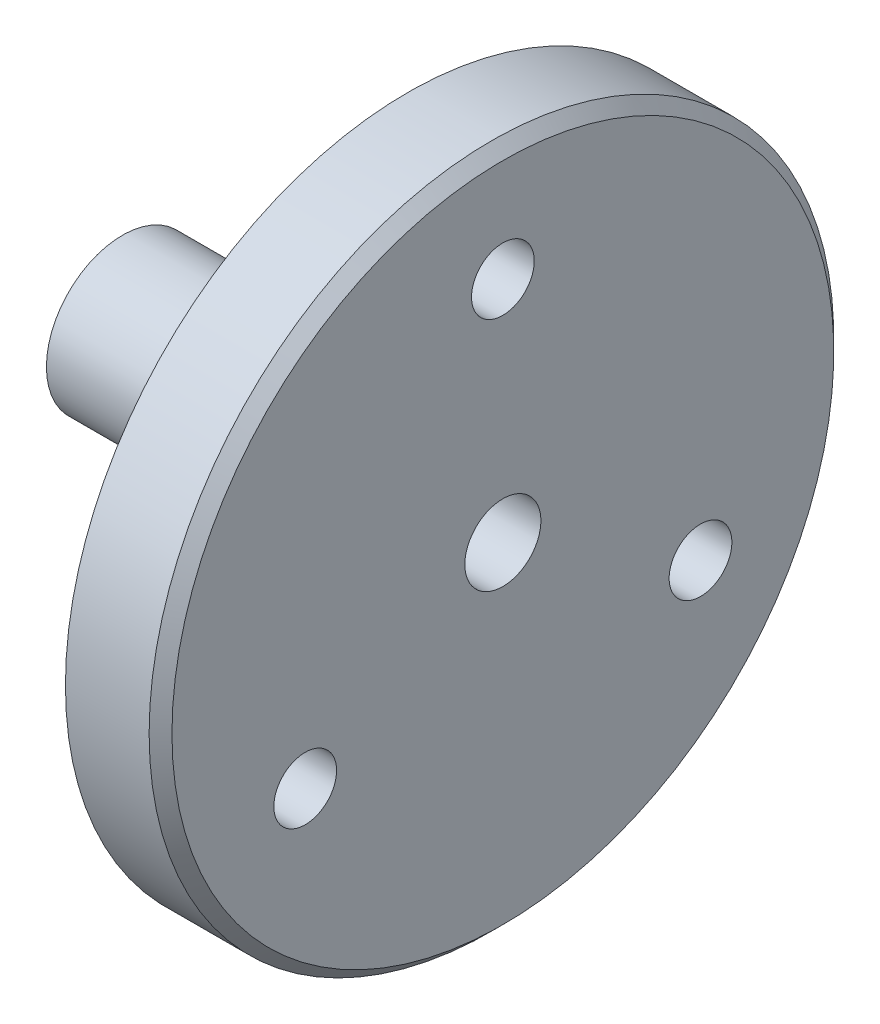
ISO-10303-21;
HEADER;
FILE_DESCRIPTION(('STEP AP214'),'2;1');
FILE_NAME('part.step','',(''),(''),'','','');
FILE_SCHEMA(('AUTOMOTIVE_DESIGN { 1 0 10303 214 1 1 1 1 }'));
ENDSEC;
DATA;
#1=APPLICATION_CONTEXT('core data for automotive mechanical design processes');
#2=APPLICATION_PROTOCOL_DEFINITION('international standard','automotive_design',2000,#1);
#3=PRODUCT_CONTEXT('',#1,'mechanical');
#4=PRODUCT('Part','Part','',(#3));
#5=PRODUCT_RELATED_PRODUCT_CATEGORY('part','',(#4));
#6=PRODUCT_DEFINITION_FORMATION('','',#4);
#7=PRODUCT_DEFINITION_CONTEXT('part definition',#1,'design');
#8=PRODUCT_DEFINITION('design','',#6,#7);
#9=PRODUCT_DEFINITION_SHAPE('','',#8);
#10=(LENGTH_UNIT() NAMED_UNIT(*) SI_UNIT(.MILLI.,.METRE.));
#11=(NAMED_UNIT(*) PLANE_ANGLE_UNIT() SI_UNIT($,.RADIAN.));
#12=(NAMED_UNIT(*) SI_UNIT($,.STERADIAN.) SOLID_ANGLE_UNIT());
#13=UNCERTAINTY_MEASURE_WITH_UNIT(LENGTH_MEASURE(1.E-05),#10,'distance_accuracy_value','');
#14=(GEOMETRIC_REPRESENTATION_CONTEXT(3) GLOBAL_UNCERTAINTY_ASSIGNED_CONTEXT((#13)) GLOBAL_UNIT_ASSIGNED_CONTEXT((#10,
#11,#12)) REPRESENTATION_CONTEXT('',''));
#15=CARTESIAN_POINT('',(0.,0.,0.));
#16=DIRECTION('',(0.,0.,1.));
#17=DIRECTION('',(1.,0.,0.));
#18=AXIS2_PLACEMENT_3D('',#15,#16,#17);
#19=CARTESIAN_POINT('',(0.,4.,0.));
#20=DIRECTION('',(1.,0.,0.));
#21=DIRECTION('',(0.,0.,-1.));
#22=AXIS2_PLACEMENT_3D('',#19,#20,#21);
#23=PLANE('',#22);
#24=CARTESIAN_POINT('',(0.,0.,0.));
#25=DIRECTION('',(-1.,0.,0.));
#26=DIRECTION('',(0.,0.,1.));
#27=AXIS2_PLACEMENT_3D('',#24,#25,#26);
#28=CIRCLE('',#27,2.);
#29=CARTESIAN_POINT('',(0.,0.,2.));
#30=VERTEX_POINT('',#29);
#31=EDGE_CURVE('E50',#30,#30,#28,.T.);
#32=ORIENTED_EDGE('',*,*,#31,.F.);
#33=EDGE_LOOP('',(#32));
#34=FACE_BOUND('',#33,.T.);
#35=CARTESIAN_POINT('',(0.,0.,0.));
#36=DIRECTION('',(-1.,0.,0.));
#37=DIRECTION('',(0.,0.,1.));
#38=AXIS2_PLACEMENT_3D('',#35,#36,#37);
#39=CIRCLE('',#38,4.);
#40=CARTESIAN_POINT('',(0.,0.,4.));
#41=VERTEX_POINT('',#40);
#42=EDGE_CURVE('E92',#41,#41,#39,.T.);
#43=ORIENTED_EDGE('',*,*,#42,.T.);
#44=EDGE_LOOP('',(#43));
#45=FACE_BOUND('',#44,.T.);
#46=ADVANCED_FACE('F38',(#34,#45),#23,.F.);
#47=CARTESIAN_POINT('',(0.,0.,0.));
#48=DIRECTION('',(-1.,0.,0.));
#49=DIRECTION('',(0.,0.,1.));
#50=AXIS2_PLACEMENT_3D('',#47,#48,#49);
#51=CYLINDRICAL_SURFACE('',#50,2.);
#52=CARTESIAN_POINT('',(13.25,0.,-2.));
#53=CARTESIAN_POINT('',(13.2499956500012,-0.0635104730002026,-1.99999595305313));
#54=CARTESIAN_POINT('',(13.2451269881822,-0.127096441053758,-1.99694323311001));
#55=CARTESIAN_POINT('',(13.2259141965705,-0.252318262265282,-1.98502167724102));
#56=CARTESIAN_POINT('',(13.2115520060745,-0.313950163299073,-1.97614175574896));
#57=CARTESIAN_POINT('',(13.1741886368379,-0.433205558136782,-1.95345852982134));
#58=CARTESIAN_POINT('',(13.1512302121591,-0.490847243665016,-1.93967960778663));
#59=CARTESIAN_POINT('',(13.0976141492032,-0.60126036886836,-1.90834598486073));
#60=CARTESIAN_POINT('',(13.0669573639908,-0.654032347276152,-1.89079170235271));
#61=CARTESIAN_POINT('',(12.996113426815,-0.757974192167973,-1.85170152902273));
#62=CARTESIAN_POINT('',(12.9553607000245,-0.808679560769977,-1.82995962224617));
#63=CARTESIAN_POINT('',(12.8667808254934,-0.90298637514676,-1.78531349913632));
#64=CARTESIAN_POINT('',(12.8189441717421,-0.946578107215733,-1.76240774858553));
#65=CARTESIAN_POINT('',(12.7099661057955,-1.03142873237132,-1.71430418655199));
#66=CARTESIAN_POINT('',(12.6479002133927,-1.07157206029151,-1.68921610993412));
#67=CARTESIAN_POINT('',(12.5164351845528,-1.14073966020039,-1.64330198128731));
#68=CARTESIAN_POINT('',(12.4470486874239,-1.16978270899534,-1.62246875996238));
#69=CARTESIAN_POINT('',(12.3211894762213,-1.20933400585981,-1.59309575627364));
#70=CARTESIAN_POINT('',(12.2660331814612,-1.22269552371393,-1.58276905990074));
#71=CARTESIAN_POINT('',(12.1536940743892,-1.2418184358548,-1.56781357325806));
#72=CARTESIAN_POINT('',(12.0965142417255,-1.24759056342088,-1.56317673673692));
#73=CARTESIAN_POINT('',(11.9815869832489,-1.2511891824572,-1.56029885782827));
#74=CARTESIAN_POINT('',(11.9238384635376,-1.24899483727851,-1.56207458771719));
#75=CARTESIAN_POINT('',(11.809689896811,-1.23676317046804,-1.5717740238392));
#76=CARTESIAN_POINT('',(11.7532909679609,-1.22671956265043,-1.5797026576711));
#77=CARTESIAN_POINT('',(11.6445615473425,-1.19968103371474,-1.60032573121781));
#78=CARTESIAN_POINT('',(11.5921675443157,-1.18285016736897,-1.61290715104814));
#79=CARTESIAN_POINT('',(11.4908388175946,-1.14290189820938,-1.64145566443406));
#80=CARTESIAN_POINT('',(11.4419053251255,-1.11978227193696,-1.65742395501353));
#81=CARTESIAN_POINT('',(11.3391667261673,-1.06294892954949,-1.6945481599302));
#82=CARTESIAN_POINT('',(11.2861591898796,-1.0280629660117,-1.71611591575959));
#83=CARTESIAN_POINT('',(11.1861697209995,-0.950881463002102,-1.76005711791243));
#84=CARTESIAN_POINT('',(11.1391940682935,-0.908578308011438,-1.78243137335975));
#85=CARTESIAN_POINT('',(11.0446982506296,-0.809519713023333,-1.82979894916857));
#86=CARTESIAN_POINT('',(10.9983670257412,-0.751531353595334,-1.85461531676593));
#87=CARTESIAN_POINT('',(10.9161491041128,-0.627148099593571,-1.90028055062445));
#88=CARTESIAN_POINT('',(10.8802583022711,-0.560756523882001,-1.92113097514764));
#89=CARTESIAN_POINT('',(10.8222363116186,-0.42488356293475,-1.95553372961316));
#90=CARTESIAN_POINT('',(10.7994659600188,-0.355763457732373,-1.96941976591574));
#91=CARTESIAN_POINT('',(10.7662350720172,-0.213612154574977,-1.98984929310048));
#92=CARTESIAN_POINT('',(10.755757105778,-0.140586648341306,-1.9964031799007));
#93=CARTESIAN_POINT('',(10.7484341499388,-0.00451561874059047,-2.00097840540091));
#94=CARTESIAN_POINT('',(10.7497968220461,0.0584027741637828,-2.00012161345511));
#95=CARTESIAN_POINT('',(10.7618828284207,0.182972117996307,-1.99258901494327));
#96=CARTESIAN_POINT('',(10.7726055250922,0.244623154962732,-1.98591360473591));
#97=CARTESIAN_POINT('',(10.802238536692,0.362521070658188,-1.9677405228307));
#98=CARTESIAN_POINT('',(10.8208121567966,0.418885009953203,-1.95644170526844));
#99=CARTESIAN_POINT('',(10.8652963892786,0.527638281070987,-1.92995684104751));
#100=CARTESIAN_POINT('',(10.8912082302552,0.580026945470713,-1.91477014350266));
#101=CARTESIAN_POINT('',(10.9525152059955,0.685084056277255,-1.87990012356));
#102=CARTESIAN_POINT('',(10.9886035692382,0.737246967843403,-1.85991764817225));
#103=CARTESIAN_POINT('',(11.0677938651528,0.83514264021734,-1.81806970001717));
#104=CARTESIAN_POINT('',(11.1109035892545,0.880868151291853,-1.79620214826384));
#105=CARTESIAN_POINT('',(11.2101350394127,0.971474198022882,-1.74905869713091));
#106=CARTESIAN_POINT('',(11.2672372062948,1.01526851939752,-1.72374883414957));
#107=CARTESIAN_POINT('',(11.3888757849443,1.09280351885684,-1.67566762748172));
#108=CARTESIAN_POINT('',(11.453407006753,1.12655115718693,-1.65289453322336));
#109=CARTESIAN_POINT('',(11.5746921480569,1.17684772011828,-1.61733530314592));
#110=CARTESIAN_POINT('',(11.6302407507322,1.19551895865479,-1.6034563619378));
#111=CARTESIAN_POINT('',(11.7443931457689,1.22500108205245,-1.58105030663767));
#112=CARTESIAN_POINT('',(11.8029920094515,1.23582424983127,-1.57251483242606));
#113=CARTESIAN_POINT('',(11.9220902768807,1.24901383653654,-1.56206324988732));
#114=CARTESIAN_POINT('',(11.9825985854882,1.25133186963292,-1.56018501674569));
#115=CARTESIAN_POINT('',(12.103130960366,1.24719778716817,-1.56349063109847));
#116=CARTESIAN_POINT('',(12.1631548590095,1.24074275650142,-1.56867682595586));
#117=CARTESIAN_POINT('',(12.2760297950514,1.22038272403399,-1.58455388771334));
#118=CARTESIAN_POINT('',(12.3290693014164,1.2071191949977,-1.5947680805106));
#119=CARTESIAN_POINT('',(12.4321350595859,1.17417623469513,-1.6191753043569));
#120=CARTESIAN_POINT('',(12.4821600445375,1.15449412799407,-1.63336999423727));
#121=CARTESIAN_POINT('',(12.5855967438727,1.10602690439618,-1.66663902886518));
#122=CARTESIAN_POINT('',(12.6384502984765,1.0763364445546,-1.68612230498997));
#123=CARTESIAN_POINT('',(12.738938367246,1.0100001703639,-1.72667706411868));
#124=CARTESIAN_POINT('',(12.7865686125605,0.973348732866945,-1.74774982276825));
#125=CARTESIAN_POINT('',(12.8850142549778,0.885670221416065,-1.79401910731181));
#126=CARTESIAN_POINT('',(12.9345908454455,0.833233674246799,-1.81920541808776));
#127=CARTESIAN_POINT('',(13.0244948297052,0.719822446025209,-1.86698729056748));
#128=CARTESIAN_POINT('',(13.0648164959274,0.658842515138555,-1.88958124364395));
#129=CARTESIAN_POINT('',(13.1347711301241,0.529355399891413,-1.92986710976548));
#130=CARTESIAN_POINT('',(13.1643860054058,0.460835727056576,-1.94755071355356));
#131=CARTESIAN_POINT('',(13.2110718843317,0.318394712729504,-1.97581521637842));
#132=CARTESIAN_POINT('',(13.2281872348698,0.244493501106855,-1.98642121428689));
#133=CARTESIAN_POINT('',(13.2422992091626,0.141418481224667,-1.99519472168143));
#134=CARTESIAN_POINT('',(13.245181865334,0.113248608862872,-1.99699172226301));
#135=CARTESIAN_POINT('',(13.2490332915376,0.0567241864870907,-1.9993953021324));
#136=CARTESIAN_POINT('',(13.25000194311,0.0283696251514532,-2.00000180773911));
#137=CARTESIAN_POINT('',(13.25,0.,-2.));
#138=B_SPLINE_CURVE_WITH_KNOTS('',3,(#52,#53,#54,#55,#56,#57,#58,#59,#60,#61,#62,#63,#64,#65,
#66,#67,#68,#69,#70,#71,#72,#73,#74,#75,#76,#77,#78,#79,#80,#81,#82,#83,#84,#85,#86,#87,#88,#89,
#90,#91,#92,#93,#94,#95,#96,#97,#98,#99,#100,#101,#102,#103,#104,#105,#106,#107,#108,#109,#110,
#111,#112,#113,#114,#115,#116,#117,#118,#119,#120,#121,#122,#123,#124,#125,#126,#127,#128,#129,
#130,#131,#132,#133,#134,#135,#136,#137),.UNSPECIFIED.,.T.,.F.,(4,2,2,2,2,2,2,2,2,2,2,2,2,2,2,2,
2,2,2,2,2,2,2,2,2,2,2,2,2,2,2,2,2,2,2,2,2,2,2,2,2,2,4),(0.,0.190412301434133,0.381187894128462,
0.571026987595135,0.760845054038795,0.965821870536219,1.17107628325702,1.40412975852973,
1.6367872460701,1.80912008879717,1.98120894707391,2.15374823498778,2.32642584505083,
2.49515839460436,2.66395067908033,2.86427450354359,3.06480522575181,3.29842180699521,
3.53194640727861,3.75284174135959,3.9734234795813,4.16127180597572,4.34910733732281,
4.52959504531298,4.71011298928466,4.90885230990552,5.10781368827686,5.33565708863713,
5.5633422719691,5.7432994031372,5.92297427413352,6.103669746882,6.28442527563864,
6.4506316903774,6.61690747313442,6.80725523036978,6.99775741153769,7.22600539035111,
7.454394245785,7.68316725607077,7.91112460944407,7.9961750123248,8.08123067890588),.UNSPECIFIED.);
#139=CARTESIAN_POINT('',(13.25,0.,-2.));
#140=VERTEX_POINT('',#139);
#141=EDGE_CURVE('E68',#140,#140,#138,.T.);
#142=ORIENTED_EDGE('',*,*,#141,.T.);
#143=EDGE_LOOP('',(#142));
#144=FACE_BOUND('',#143,.T.);
#145=CARTESIAN_POINT('',(20.,0.,0.));
#146=DIRECTION('',(-1.,0.,0.));
#147=DIRECTION('',(0.,0.,1.));
#148=AXIS2_PLACEMENT_3D('',#145,#146,#147);
#149=CIRCLE('',#148,2.);
#150=CARTESIAN_POINT('',(20.,0.,2.));
#151=VERTEX_POINT('',#150);
#152=EDGE_CURVE('E54',#151,#151,#149,.T.);
#153=ORIENTED_EDGE('',*,*,#152,.F.);
#154=EDGE_LOOP('',(#153));
#155=FACE_BOUND('',#154,.T.);
#156=ORIENTED_EDGE('',*,*,#31,.T.);
#157=EDGE_LOOP('',(#156));
#158=FACE_BOUND('',#157,.T.);
#159=ADVANCED_FACE('F95',(#144,#155,#158),#51,.F.);
#160=CARTESIAN_POINT('',(20.,2.,0.));
#161=DIRECTION('',(-1.,0.,0.));
#162=DIRECTION('',(0.,0.,1.));
#163=AXIS2_PLACEMENT_3D('',#160,#161,#162);
#164=PLANE('',#163);
#165=CARTESIAN_POINT('',(20.,0.,0.));
#166=DIRECTION('',(-1.,0.,0.));
#167=DIRECTION('',(0.,0.,1.));
#168=AXIS2_PLACEMENT_3D('',#165,#166,#167);
#169=CIRCLE('',#168,17.4);
#170=CARTESIAN_POINT('',(20.,0.,17.4));
#171=VERTEX_POINT('',#170);
#172=EDGE_CURVE('E10',#171,#171,#169,.F.);
#173=ORIENTED_EDGE('',*,*,#172,.T.);
#174=EDGE_LOOP('',(#173));
#175=FACE_BOUND('',#174,.T.);
#176=CARTESIAN_POINT('',(20.,-5.9999999999999,10.3923048454133));
#177=DIRECTION('',(1.,0.,0.));
#178=DIRECTION('',(0.,0.,-1.));
#179=AXIS2_PLACEMENT_3D('',#176,#177,#178);
#180=CIRCLE('',#179,1.65);
#181=CARTESIAN_POINT('',(20.,-5.9999999999999,8.74230484541332));
#182=VERTEX_POINT('',#181);
#183=EDGE_CURVE('E140',#182,#182,#180,.T.);
#184=ORIENTED_EDGE('',*,*,#183,.F.);
#185=EDGE_LOOP('',(#184));
#186=FACE_BOUND('',#185,.T.);
#187=CARTESIAN_POINT('',(20.,-6.00000000000005,-10.3923048454132));
#188=DIRECTION('',(1.,0.,0.));
#189=DIRECTION('',(0.,0.,-1.));
#190=AXIS2_PLACEMENT_3D('',#187,#188,#189);
#191=CIRCLE('',#190,1.65);
#192=CARTESIAN_POINT('',(20.,-6.00000000000005,-12.0423048454132));
#193=VERTEX_POINT('',#192);
#194=EDGE_CURVE('E144',#193,#193,#191,.T.);
#195=ORIENTED_EDGE('',*,*,#194,.F.);
#196=EDGE_LOOP('',(#195));
#197=FACE_BOUND('',#196,.T.);
#198=CARTESIAN_POINT('',(20.,12.,0.));
#199=DIRECTION('',(1.,0.,0.));
#200=DIRECTION('',(0.,0.,-1.));
#201=AXIS2_PLACEMENT_3D('',#198,#199,#200);
#202=CIRCLE('',#201,1.65);
#203=CARTESIAN_POINT('',(20.,12.,-1.65));
#204=VERTEX_POINT('',#203);
#205=EDGE_CURVE('E61',#204,#204,#202,.T.);
#206=ORIENTED_EDGE('',*,*,#205,.F.);
#207=EDGE_LOOP('',(#206));
#208=FACE_BOUND('',#207,.T.);
#209=ORIENTED_EDGE('',*,*,#152,.T.);
#210=EDGE_LOOP('',(#209));
#211=FACE_BOUND('',#210,.T.);
#212=ADVANCED_FACE('F99',(#175,#186,#197,#208,#211),#164,.F.);
#213=CARTESIAN_POINT('',(0.,0.,0.));
#214=DIRECTION('',(-1.,0.,0.));
#215=DIRECTION('',(0.,0.,1.));
#216=AXIS2_PLACEMENT_3D('',#213,#214,#215);
#217=CYLINDRICAL_SURFACE('',#216,18.);
#218=CARTESIAN_POINT('',(19.4,0.,0.));
#219=DIRECTION('',(-1.,0.,0.));
#220=DIRECTION('',(0.,0.,1.));
#221=AXIS2_PLACEMENT_3D('',#218,#219,#220);
#222=CIRCLE('',#221,18.);
#223=CARTESIAN_POINT('',(19.4,0.,18.));
#224=VERTEX_POINT('',#223);
#225=EDGE_CURVE('E46',#224,#224,#222,.T.);
#226=ORIENTED_EDGE('',*,*,#225,.T.);
#227=EDGE_LOOP('',(#226));
#228=FACE_BOUND('',#227,.T.);
#229=CARTESIAN_POINT('',(15.,0.,0.));
#230=DIRECTION('',(-1.,0.,0.));
#231=DIRECTION('',(0.,0.,1.));
#232=AXIS2_PLACEMENT_3D('',#229,#230,#231);
#233=CIRCLE('',#232,18.);
#234=CARTESIAN_POINT('',(15.,0.,18.));
#235=VERTEX_POINT('',#234);
#236=EDGE_CURVE('E122',#235,#235,#233,.T.);
#237=ORIENTED_EDGE('',*,*,#236,.F.);
#238=EDGE_LOOP('',(#237));
#239=FACE_BOUND('',#238,.T.);
#240=ADVANCED_FACE('F130',(#228,#239),#217,.T.);
#241=CARTESIAN_POINT('',(15.,18.,0.));
#242=DIRECTION('',(1.,0.,0.));
#243=DIRECTION('',(0.,0.,-1.));
#244=AXIS2_PLACEMENT_3D('',#241,#242,#243);
#245=PLANE('',#244);
#246=CARTESIAN_POINT('',(15.,-5.9999999999999,10.3923048454133));
#247=DIRECTION('',(1.,0.,0.));
#248=DIRECTION('',(0.,0.,-1.));
#249=AXIS2_PLACEMENT_3D('',#246,#247,#248);
#250=CIRCLE('',#249,1.65);
#251=CARTESIAN_POINT('',(15.,-5.9999999999999,8.74230484541332));
#252=VERTEX_POINT('',#251);
#253=EDGE_CURVE('E152',#252,#252,#250,.T.);
#254=ORIENTED_EDGE('',*,*,#253,.T.);
#255=EDGE_LOOP('',(#254));
#256=FACE_BOUND('',#255,.T.);
#257=CARTESIAN_POINT('',(15.,-6.00000000000005,-10.3923048454132));
#258=DIRECTION('',(1.,0.,0.));
#259=DIRECTION('',(0.,0.,-1.));
#260=AXIS2_PLACEMENT_3D('',#257,#258,#259);
#261=CIRCLE('',#260,1.65);
#262=CARTESIAN_POINT('',(15.,-6.00000000000005,-12.0423048454132));
#263=VERTEX_POINT('',#262);
#264=EDGE_CURVE('E148',#263,#263,#261,.T.);
#265=ORIENTED_EDGE('',*,*,#264,.T.);
#266=EDGE_LOOP('',(#265));
#267=FACE_BOUND('',#266,.T.);
#268=CARTESIAN_POINT('',(15.,12.,0.));
#269=DIRECTION('',(1.,0.,0.));
#270=DIRECTION('',(0.,0.,-1.));
#271=AXIS2_PLACEMENT_3D('',#268,#269,#270);
#272=CIRCLE('',#271,1.65);
#273=CARTESIAN_POINT('',(15.,12.,-1.65));
#274=VERTEX_POINT('',#273);
#275=EDGE_CURVE('E57',#274,#274,#272,.T.);
#276=ORIENTED_EDGE('',*,*,#275,.T.);
#277=EDGE_LOOP('',(#276));
#278=FACE_BOUND('',#277,.T.);
#279=CARTESIAN_POINT('',(15.,0.,0.));
#280=DIRECTION('',(-1.,0.,0.));
#281=DIRECTION('',(0.,0.,1.));
#282=AXIS2_PLACEMENT_3D('',#279,#280,#281);
#283=CIRCLE('',#282,7.5);
#284=CARTESIAN_POINT('',(15.,0.,7.5));
#285=VERTEX_POINT('',#284);
#286=EDGE_CURVE('E117',#285,#285,#283,.T.);
#287=ORIENTED_EDGE('',*,*,#286,.F.);
#288=EDGE_LOOP('',(#287));
#289=FACE_BOUND('',#288,.T.);
#290=ORIENTED_EDGE('',*,*,#236,.T.);
#291=EDGE_LOOP('',(#290));
#292=FACE_BOUND('',#291,.T.);
#293=ADVANCED_FACE('F135',(#256,#267,#278,#289,#292),#245,.F.);
#294=CARTESIAN_POINT('',(0.,0.,0.));
#295=DIRECTION('',(-1.,0.,0.));
#296=DIRECTION('',(0.,0.,1.));
#297=AXIS2_PLACEMENT_3D('',#294,#295,#296);
#298=CYLINDRICAL_SURFACE('',#297,7.5);
#299=CARTESIAN_POINT('',(13.25,0.,-7.5));
#300=CARTESIAN_POINT('',(13.2499972055261,0.0696954524791074,-7.49999880584412));
#301=CARTESIAN_POINT('',(13.2441513625155,0.13942894091941,-7.49901838956517));
#302=CARTESIAN_POINT('',(13.2209321706173,0.276940110836521,-7.49520172470694));
#303=CARTESIAN_POINT('',(13.2035482215442,0.344715933979623,-7.49236376961945));
#304=CARTESIAN_POINT('',(13.1577922757036,0.476302373606322,-7.48515034118225));
#305=CARTESIAN_POINT('',(13.1294292671797,0.54011618421595,-7.48077612579596));
#306=CARTESIAN_POINT('',(13.0625438539738,0.662070920988972,-7.47097113541035));
#307=CARTESIAN_POINT('',(13.0240226112585,0.720212494939295,-7.46554048127217));
#308=CARTESIAN_POINT('',(12.9375224580898,0.82973630714584,-7.45416658729156));
#309=CARTESIAN_POINT('',(12.8894654426819,0.881056451767484,-7.44821935907428));
#310=CARTESIAN_POINT('',(12.7854260157636,0.974944249329964,-7.43651313438366));
#311=CARTESIAN_POINT('',(12.7294431042717,1.01751134969549,-7.43075414981334));
#312=CARTESIAN_POINT('',(12.6107145169015,1.09293356280257,-7.4200378287989));
#313=CARTESIAN_POINT('',(12.5479293315976,1.1257272764305,-7.41508564545818));
#314=CARTESIAN_POINT('',(12.4176452178497,1.18027918270561,-7.40659894897337));
#315=CARTESIAN_POINT('',(12.3501466081612,1.20203812078281,-7.40306434007154));
#316=CARTESIAN_POINT('',(12.2130098625717,1.2337071888924,-7.39785268421378));
#317=CARTESIAN_POINT('',(12.1433971317493,1.2437245145677,-7.3961588424285));
#318=CARTESIAN_POINT('',(12.0034598615583,1.25195836264494,-7.39476969468325));
#319=CARTESIAN_POINT('',(11.9331353729164,1.2501757201945,-7.39507424728607));
#320=CARTESIAN_POINT('',(11.7945360693623,1.23494754919808,-7.39763214431777));
#321=CARTESIAN_POINT('',(11.7262475982274,1.22162244094489,-7.39986536659458));
#322=CARTESIAN_POINT('',(11.5928893410854,1.18387657020172,-7.40599747605504));
#323=CARTESIAN_POINT('',(11.5278196655557,1.15945542715987,-7.40989642036636));
#324=CARTESIAN_POINT('',(11.4023855882795,1.10008862304696,-7.4189423966705));
#325=CARTESIAN_POINT('',(11.3420452969594,1.06509295693986,-7.42409533553663));
#326=CARTESIAN_POINT('',(11.2280477997308,0.985606008778716,-7.43506459207504));
#327=CARTESIAN_POINT('',(11.1743911337725,0.941113960327143,-7.44088096327143));
#328=CARTESIAN_POINT('',(11.0745869570963,0.843241106079526,-7.45261013939893));
#329=CARTESIAN_POINT('',(11.02854074073,0.789756981936563,-7.45852324615826));
#330=CARTESIAN_POINT('',(10.9460611186673,0.675767624490823,-7.46971300698362));
#331=CARTESIAN_POINT('',(10.9096277749084,0.615262345953211,-7.47498965694873));
#332=CARTESIAN_POINT('',(10.8473988864319,0.488852958083356,-7.48431946446456));
#333=CARTESIAN_POINT('',(10.8216122903344,0.422944362782331,-7.48837159203724));
#334=CARTESIAN_POINT('',(10.781502892377,0.287649172801365,-7.4947875150633));
#335=CARTESIAN_POINT('',(10.7671791315131,0.218262869589733,-7.49715145175237));
#336=CARTESIAN_POINT('',(10.7505393207694,0.0788549506508106,-7.49990564921343));
#337=CARTESIAN_POINT('',(10.7480842140972,0.00885036857550458,-7.50031876506392));
#338=CARTESIAN_POINT('',(10.7548806722141,-0.130569886444944,-7.49918737210585));
#339=CARTESIAN_POINT('',(10.7641317865669,-0.19998558194602,-7.49764293862059));
#340=CARTESIAN_POINT('',(10.7939624246677,-0.335828087773382,-7.49278413469101));
#341=CARTESIAN_POINT('',(10.8144731041951,-0.40227043419269,-7.48948052400655));
#342=CARTESIAN_POINT('',(10.8661672590998,-0.530773442430222,-7.48147232227679));
#343=CARTESIAN_POINT('',(10.8973513338176,-0.59283385795486,-7.4767676525601));
#344=CARTESIAN_POINT('',(10.9698255623484,-0.711415344734479,-7.46642258151204));
#345=CARTESIAN_POINT('',(11.0112025780836,-0.767882625468574,-7.46077427943511));
#346=CARTESIAN_POINT('',(11.1027686576925,-0.873121792751344,-7.4491923369595));
#347=CARTESIAN_POINT('',(11.1529583616383,-0.921893119848291,-7.44325867585773));
#348=CARTESIAN_POINT('',(11.2613487740357,-1.010871389829,-7.43170087617923));
#349=CARTESIAN_POINT('',(11.3196270827572,-1.05098438055686,-7.42608058068553));
#350=CARTESIAN_POINT('',(11.4421764845693,-1.12085115514749,-7.41585764888942));
#351=CARTESIAN_POINT('',(11.5064473876137,-1.15060526738491,-7.4112549803301));
#352=CARTESIAN_POINT('',(11.6388948664061,-1.19876916573657,-7.40361726848852));
#353=CARTESIAN_POINT('',(11.7070540475152,-1.21722571627397,-7.40057577155532));
#354=CARTESIAN_POINT('',(11.8455600646109,-1.24241772688914,-7.3963885841763));
#355=CARTESIAN_POINT('',(11.915906709866,-1.24915420597308,-7.39524272891361));
#356=CARTESIAN_POINT('',(12.0558525829812,-1.25068643302368,-7.39498366542006));
#357=CARTESIAN_POINT('',(12.1254501892876,-1.24563006806259,-7.39584528252825));
#358=CARTESIAN_POINT('',(12.2627896240254,-1.22403991947842,-7.39944890726864));
#359=CARTESIAN_POINT('',(12.3305314584709,-1.20750617305624,-7.40219090880607));
#360=CARTESIAN_POINT('',(12.4621792186463,-1.16348724479745,-7.40923678140859));
#361=CARTESIAN_POINT('',(12.526089505028,-1.13601479530022,-7.41353883609835));
#362=CARTESIAN_POINT('',(12.6484178345974,-1.07091350195795,-7.42322184461104));
#363=CARTESIAN_POINT('',(12.7068356051861,-1.03328415437428,-7.428602851942));
#364=CARTESIAN_POINT('',(12.8172677915539,-0.948409442186078,-7.43991727022811));
#365=CARTESIAN_POINT('',(12.8691980083501,-0.901055281796824,-7.44585647788151));
#366=CARTESIAN_POINT('',(12.9644258022375,-0.798304515690115,-7.4575718618042));
#367=CARTESIAN_POINT('',(13.0077213843191,-0.742906056456318,-7.46334800013273));
#368=CARTESIAN_POINT('',(13.0847241341,-0.625184584820141,-7.4741326482111));
#369=CARTESIAN_POINT('',(13.1183630196565,-0.562816393766409,-7.47913558126552));
#370=CARTESIAN_POINT('',(13.174634742305,-0.433256534689491,-7.48775583800888));
#371=CARTESIAN_POINT('',(13.1972785405398,-0.366069747415005,-7.49137454088741));
#372=CARTESIAN_POINT('',(13.2260026370633,-0.248851655022701,-7.49602895416478));
#373=CARTESIAN_POINT('',(13.234987234808,-0.199529415149224,-7.49751013636679));
#374=CARTESIAN_POINT('',(13.2469868689224,-0.100144655159905,-7.4994960799306));
#375=CARTESIAN_POINT('',(13.2500020080687,-0.0500821478042471,-7.50000085810321));
#376=CARTESIAN_POINT('',(13.25,0.,-7.5));
#377=B_SPLINE_CURVE_WITH_KNOTS('',3,(#299,#300,#301,#302,#303,#304,#305,#306,#307,#308,#309,
#310,#311,#312,#313,#314,#315,#316,#317,#318,#319,#320,#321,#322,#323,#324,#325,#326,#327,#328,
#329,#330,#331,#332,#333,#334,#335,#336,#337,#338,#339,#340,#341,#342,#343,#344,#345,#346,#347,
#348,#349,#350,#351,#352,#353,#354,#355,#356,#357,#358,#359,#360,#361,#362,#363,#364,#365,#366,
#367,#368,#369,#370,#371,#372,#373,#374,#375,#376),.UNSPECIFIED.,.T.,.F.,(4,2,2,2,2,2,2,2,2,2,2,
2,2,2,2,2,2,2,2,2,2,2,2,2,2,2,2,2,2,2,2,2,2,2,2,2,2,2,4),(0.,0.208903292469255,0.41799877284771,
0.626923433512635,0.835824206337395,1.04651245531166,1.25721400084928,1.4692126041192,
1.68119688438091,1.89123038551712,2.10124902160443,2.30910260880204,2.5169633251269,
2.72582278316279,2.93469910340287,3.14616384955663,3.35762995817924,3.56927344457951,
3.78089922260574,3.99003941745698,4.1991715651793,4.40703903503208,4.61491817913033,
4.82463412813512,5.03436531527141,5.24626911003809,5.45816618687971,5.66918011170886,
5.88017568893309,6.0885395476135,6.29690273094066,6.50502409113111,6.71315577514668,
6.92375692096696,7.13440666939486,7.34651115803599,7.55840376065035,7.70852124082009,
7.85863613638484),.UNSPECIFIED.);
#378=CARTESIAN_POINT('',(13.25,0.,-7.5));
#379=VERTEX_POINT('',#378);
#380=EDGE_CURVE('E60',#379,#379,#377,.T.);
#381=ORIENTED_EDGE('',*,*,#380,.T.);
#382=EDGE_LOOP('',(#381));
#383=FACE_BOUND('',#382,.T.);
#384=CARTESIAN_POINT('',(9.,0.,0.));
#385=DIRECTION('',(-1.,0.,0.));
#386=DIRECTION('',(0.,0.,1.));
#387=AXIS2_PLACEMENT_3D('',#384,#385,#386);
#388=CIRCLE('',#387,7.5);
#389=CARTESIAN_POINT('',(9.,0.,7.5));
#390=VERTEX_POINT('',#389);
#391=EDGE_CURVE('E113',#390,#390,#388,.T.);
#392=ORIENTED_EDGE('',*,*,#391,.F.);
#393=EDGE_LOOP('',(#392));
#394=FACE_BOUND('',#393,.T.);
#395=ORIENTED_EDGE('',*,*,#286,.T.);
#396=EDGE_LOOP('',(#395));
#397=FACE_BOUND('',#396,.T.);
#398=ADVANCED_FACE('F70',(#383,#394,#397),#298,.T.);
#399=CARTESIAN_POINT('',(9.,4.,0.));
#400=DIRECTION('',(1.,0.,0.));
#401=DIRECTION('',(0.,0.,-1.));
#402=AXIS2_PLACEMENT_3D('',#399,#400,#401);
#403=PLANE('',#402);
#404=CARTESIAN_POINT('',(9.,0.,0.));
#405=DIRECTION('',(-1.,0.,0.));
#406=DIRECTION('',(0.,0.,1.));
#407=AXIS2_PLACEMENT_3D('',#404,#405,#406);
#408=CIRCLE('',#407,4.);
#409=CARTESIAN_POINT('',(9.,0.,4.));
#410=VERTEX_POINT('',#409);
#411=EDGE_CURVE('E111',#410,#410,#408,.T.);
#412=ORIENTED_EDGE('',*,*,#411,.F.);
#413=EDGE_LOOP('',(#412));
#414=FACE_BOUND('',#413,.T.);
#415=ORIENTED_EDGE('',*,*,#391,.T.);
#416=EDGE_LOOP('',(#415));
#417=FACE_BOUND('',#416,.T.);
#418=ADVANCED_FACE('F175',(#414,#417),#403,.F.);
#419=CARTESIAN_POINT('',(0.,0.,0.));
#420=DIRECTION('',(-1.,0.,0.));
#421=DIRECTION('',(0.,0.,1.));
#422=AXIS2_PLACEMENT_3D('',#419,#420,#421);
#423=CYLINDRICAL_SURFACE('',#422,4.);
#424=ORIENTED_EDGE('',*,*,#42,.F.);
#425=EDGE_LOOP('',(#424));
#426=FACE_BOUND('',#425,.T.);
#427=ORIENTED_EDGE('',*,*,#411,.T.);
#428=EDGE_LOOP('',(#427));
#429=FACE_BOUND('',#428,.T.);
#430=ADVANCED_FACE('F80',(#426,#429),#423,.T.);
#431=CARTESIAN_POINT('',(12.,0.,-18.));
#432=DIRECTION('',(0.,0.,1.));
#433=DIRECTION('',(1.,0.,0.));
#434=AXIS2_PLACEMENT_3D('',#431,#432,#433);
#435=CYLINDRICAL_SURFACE('',#434,1.25);
#436=ORIENTED_EDGE('',*,*,#380,.F.);
#437=EDGE_LOOP('',(#436));
#438=FACE_BOUND('',#437,.T.);
#439=ORIENTED_EDGE('',*,*,#141,.F.);
#440=EDGE_LOOP('',(#439));
#441=FACE_BOUND('',#440,.T.);
#442=ADVANCED_FACE('F74',(#438,#441),#435,.F.);
#443=CARTESIAN_POINT('',(20.,12.,0.));
#444=DIRECTION('',(1.,0.,0.));
#445=DIRECTION('',(0.,0.,-1.));
#446=AXIS2_PLACEMENT_3D('',#443,#444,#445);
#447=CYLINDRICAL_SURFACE('',#446,1.65);
#448=ORIENTED_EDGE('',*,*,#205,.T.);
#449=EDGE_LOOP('',(#448));
#450=FACE_BOUND('',#449,.T.);
#451=ORIENTED_EDGE('',*,*,#275,.F.);
#452=EDGE_LOOP('',(#451));
#453=FACE_BOUND('',#452,.T.);
#454=ADVANCED_FACE('F79',(#450,#453),#447,.F.);
#455=CARTESIAN_POINT('',(20.,-6.00000000000005,-10.3923048454132));
#456=DIRECTION('',(1.,0.,0.));
#457=DIRECTION('',(0.,0.,-1.));
#458=AXIS2_PLACEMENT_3D('',#455,#456,#457);
#459=CYLINDRICAL_SURFACE('',#458,1.65);
#460=ORIENTED_EDGE('',*,*,#194,.T.);
#461=EDGE_LOOP('',(#460));
#462=FACE_BOUND('',#461,.T.);
#463=ORIENTED_EDGE('',*,*,#264,.F.);
#464=EDGE_LOOP('',(#463));
#465=FACE_BOUND('',#464,.T.);
#466=ADVANCED_FACE('F161',(#462,#465),#459,.F.);
#467=CARTESIAN_POINT('',(20.,-5.9999999999999,10.3923048454133));
#468=DIRECTION('',(1.,0.,0.));
#469=DIRECTION('',(0.,0.,-1.));
#470=AXIS2_PLACEMENT_3D('',#467,#468,#469);
#471=CYLINDRICAL_SURFACE('',#470,1.65);
#472=ORIENTED_EDGE('',*,*,#183,.T.);
#473=EDGE_LOOP('',(#472));
#474=FACE_BOUND('',#473,.T.);
#475=ORIENTED_EDGE('',*,*,#253,.F.);
#476=EDGE_LOOP('',(#475));
#477=FACE_BOUND('',#476,.T.);
#478=ADVANCED_FACE('F158',(#474,#477),#471,.F.);
#479=CARTESIAN_POINT('',(19.4,0.,0.));
#480=DIRECTION('',(-1.,0.,0.));
#481=DIRECTION('',(0.,0.,1.));
#482=AXIS2_PLACEMENT_3D('',#479,#480,#481);
#483=CONICAL_SURFACE('',#482,18.,0.785398163397448);
#484=ORIENTED_EDGE('',*,*,#172,.F.);
#485=EDGE_LOOP('',(#484));
#486=FACE_BOUND('',#485,.T.);
#487=ORIENTED_EDGE('',*,*,#225,.F.);
#488=EDGE_LOOP('',(#487));
#489=FACE_BOUND('',#488,.T.);
#490=ADVANCED_FACE('F41',(#486,#489),#483,.T.);
#491=CLOSED_SHELL('',(#46,#159,#212,#240,#293,#398,#418,#430,#442,#454,#466,#478,#490));
#492=MANIFOLD_SOLID_BREP('B2',#491);
#493=ADVANCED_BREP_SHAPE_REPRESENTATION('',(#18,#492),#14);
#494=SHAPE_DEFINITION_REPRESENTATION(#9,#493);
ENDSEC;
END-ISO-10303-21;
